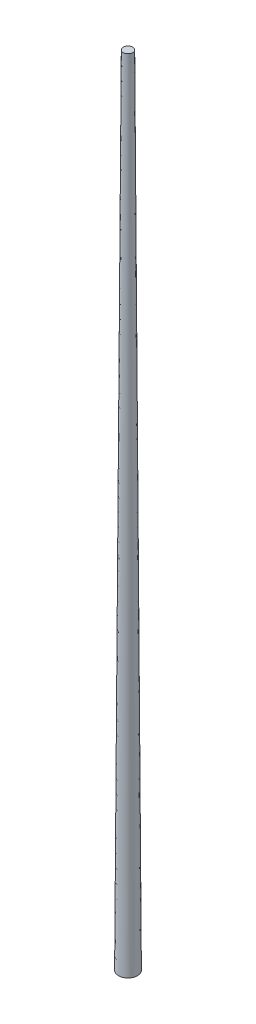
ISO-10303-21;
HEADER;
FILE_DESCRIPTION(('STEP AP214'),'2;1');
FILE_NAME('part.step','',(''),(''),'','','');
FILE_SCHEMA(('AUTOMOTIVE_DESIGN { 1 0 10303 214 1 1 1 1 }'));
ENDSEC;
DATA;
#1=APPLICATION_CONTEXT('core data for automotive mechanical design processes');
#2=APPLICATION_PROTOCOL_DEFINITION('international standard','automotive_design',2000,#1);
#3=PRODUCT_CONTEXT('',#1,'mechanical');
#4=PRODUCT('Part','Part','',(#3));
#5=PRODUCT_RELATED_PRODUCT_CATEGORY('part','',(#4));
#6=PRODUCT_DEFINITION_FORMATION('','',#4);
#7=PRODUCT_DEFINITION_CONTEXT('part definition',#1,'design');
#8=PRODUCT_DEFINITION('design','',#6,#7);
#9=PRODUCT_DEFINITION_SHAPE('','',#8);
#10=(LENGTH_UNIT() NAMED_UNIT(*) SI_UNIT(.MILLI.,.METRE.));
#11=(NAMED_UNIT(*) PLANE_ANGLE_UNIT() SI_UNIT($,.RADIAN.));
#12=(NAMED_UNIT(*) SI_UNIT($,.STERADIAN.) SOLID_ANGLE_UNIT());
#13=UNCERTAINTY_MEASURE_WITH_UNIT(LENGTH_MEASURE(1.E-05),#10,'distance_accuracy_value','');
#14=(GEOMETRIC_REPRESENTATION_CONTEXT(3) GLOBAL_UNCERTAINTY_ASSIGNED_CONTEXT((#13)) GLOBAL_UNIT_ASSIGNED_CONTEXT((#10,
#11,#12)) REPRESENTATION_CONTEXT('',''));
#15=CARTESIAN_POINT('',(0.,0.,0.));
#16=DIRECTION('',(0.,0.,1.));
#17=DIRECTION('',(1.,0.,0.));
#18=AXIS2_PLACEMENT_3D('',#15,#16,#17);
#19=CARTESIAN_POINT('',(0.,0.,0.));
#20=DIRECTION('',(0.,1.,0.));
#21=DIRECTION('',(0.,0.,1.));
#22=AXIS2_PLACEMENT_3D('',#19,#20,#21);
#23=PLANE('',#22);
#24=CARTESIAN_POINT('',(0.,0.,0.));
#25=DIRECTION('',(0.,1.,0.));
#26=DIRECTION('',(0.,0.,1.));
#27=AXIS2_PLACEMENT_3D('',#24,#25,#26);
#28=CIRCLE('',#27,10.);
#29=CARTESIAN_POINT('',(0.,0.,10.));
#30=VERTEX_POINT('',#29);
#31=EDGE_CURVE('E10',#30,#30,#28,.T.);
#32=ORIENTED_EDGE('',*,*,#31,.F.);
#33=EDGE_LOOP('',(#32));
#34=FACE_BOUND('',#33,.T.);
#35=ADVANCED_FACE('F31',(#34),#23,.F.);
#36=CARTESIAN_POINT('',(0.,0.,0.));
#37=DIRECTION('',(0.,-1.,0.));
#38=DIRECTION('',(0.,0.,-1.));
#39=AXIS2_PLACEMENT_3D('',#36,#37,#38);
#40=CONICAL_SURFACE('',#39,10.,0.00595231065459163);
#41=CARTESIAN_POINT('',(0.,840.,0.));
#42=DIRECTION('',(0.,1.,0.));
#43=DIRECTION('',(0.,0.,1.));
#44=AXIS2_PLACEMENT_3D('',#41,#42,#43);
#45=CIRCLE('',#44,5.);
#46=CARTESIAN_POINT('',(0.,840.,5.));
#47=VERTEX_POINT('',#46);
#48=EDGE_CURVE('E37',#47,#47,#45,.T.);
#49=ORIENTED_EDGE('',*,*,#48,.F.);
#50=EDGE_LOOP('',(#49));
#51=FACE_BOUND('',#50,.T.);
#52=ORIENTED_EDGE('',*,*,#31,.T.);
#53=EDGE_LOOP('',(#52));
#54=FACE_BOUND('',#53,.T.);
#55=ADVANCED_FACE('F45',(#51,#54),#40,.T.);
#56=CARTESIAN_POINT('',(5.,840.,0.));
#57=DIRECTION('',(0.,-1.,0.));
#58=DIRECTION('',(0.,0.,-1.));
#59=AXIS2_PLACEMENT_3D('',#56,#57,#58);
#60=PLANE('',#59);
#61=ORIENTED_EDGE('',*,*,#48,.T.);
#62=EDGE_LOOP('',(#61));
#63=FACE_BOUND('',#62,.T.);
#64=ADVANCED_FACE('F43',(#63),#60,.F.);
#65=CLOSED_SHELL('',(#35,#55,#64));
#66=MANIFOLD_SOLID_BREP('B2',#65);
#67=ADVANCED_BREP_SHAPE_REPRESENTATION('',(#18,#66),#14);
#68=SHAPE_DEFINITION_REPRESENTATION(#9,#67);
ENDSEC;
END-ISO-10303-21;
